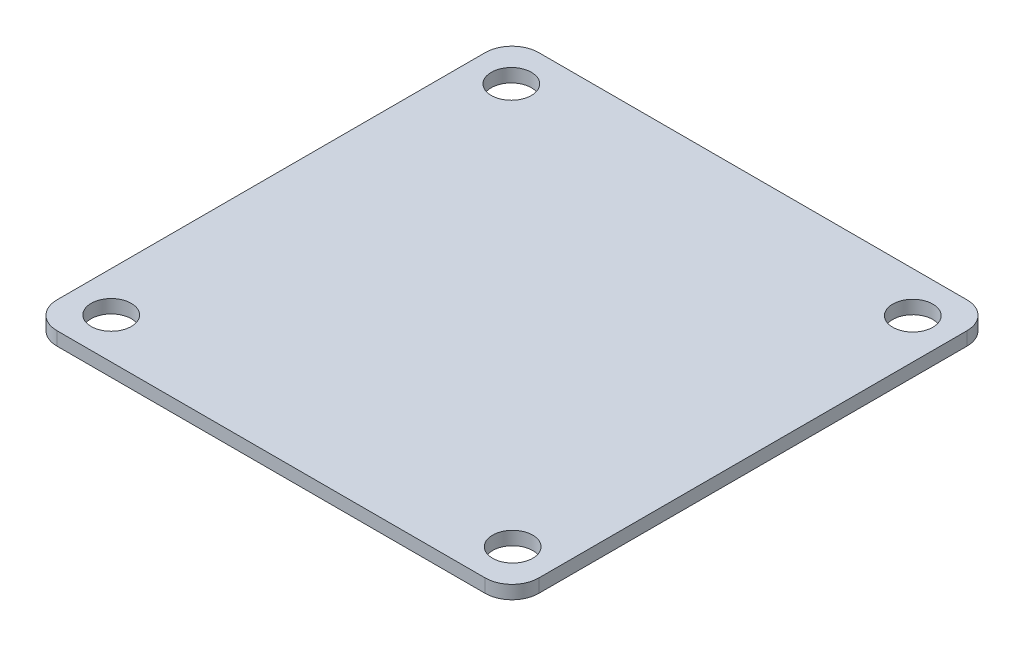
ISO-10303-21;
HEADER;
FILE_DESCRIPTION(('STEP AP214'),'2;1');
FILE_NAME('part.step','',(''),(''),'','','');
FILE_SCHEMA(('AUTOMOTIVE_DESIGN { 1 0 10303 214 1 1 1 1 }'));
ENDSEC;
DATA;
#1=APPLICATION_CONTEXT('core data for automotive mechanical design processes');
#2=APPLICATION_PROTOCOL_DEFINITION('international standard','automotive_design',2000,#1);
#3=PRODUCT_CONTEXT('',#1,'mechanical');
#4=PRODUCT('Part','Part','',(#3));
#5=PRODUCT_RELATED_PRODUCT_CATEGORY('part','',(#4));
#6=PRODUCT_DEFINITION_FORMATION('','',#4);
#7=PRODUCT_DEFINITION_CONTEXT('part definition',#1,'design');
#8=PRODUCT_DEFINITION('design','',#6,#7);
#9=PRODUCT_DEFINITION_SHAPE('','',#8);
#10=(LENGTH_UNIT() NAMED_UNIT(*) SI_UNIT(.MILLI.,.METRE.));
#11=(NAMED_UNIT(*) PLANE_ANGLE_UNIT() SI_UNIT($,.RADIAN.));
#12=(NAMED_UNIT(*) SI_UNIT($,.STERADIAN.) SOLID_ANGLE_UNIT());
#13=UNCERTAINTY_MEASURE_WITH_UNIT(LENGTH_MEASURE(1.E-05),#10,'distance_accuracy_value','');
#14=(GEOMETRIC_REPRESENTATION_CONTEXT(3) GLOBAL_UNCERTAINTY_ASSIGNED_CONTEXT((#13)) GLOBAL_UNIT_ASSIGNED_CONTEXT((#10,
#11,#12)) REPRESENTATION_CONTEXT('',''));
#15=CARTESIAN_POINT('',(0.,0.,0.));
#16=DIRECTION('',(0.,0.,1.));
#17=DIRECTION('',(1.,0.,0.));
#18=AXIS2_PLACEMENT_3D('',#15,#16,#17);
#19=CARTESIAN_POINT('',(0.,1.25767452008319E-13,-36.));
#20=DIRECTION('',(0.,1.,0.));
#21=DIRECTION('',(0.,0.,1.));
#22=AXIS2_PLACEMENT_3D('',#19,#20,#21);
#23=PLANE('',#22);
#24=DIRECTION('',(0.,0.,-1.));
#25=VECTOR('',#24,1.);
#26=CARTESIAN_POINT('',(0.,1.25767452008319E-13,-36.));
#27=LINE('',#26,#25);
#28=CARTESIAN_POINT('',(0.,-1.11653279033015E-13,-2.));
#29=VERTEX_POINT('',#28);
#30=CARTESIAN_POINT('',(0.,1.11801526652946E-13,-34.));
#31=VERTEX_POINT('',#30);
#32=EDGE_CURVE('E139',#29,#31,#27,.T.);
#33=ORIENTED_EDGE('',*,*,#32,.T.);
#34=CARTESIAN_POINT('',(2.,1.11801526652946E-13,-34.));
#35=DIRECTION('',(0.,1.,0.));
#36=DIRECTION('',(0.,0.,1.));
#37=AXIS2_PLACEMENT_3D('',#34,#35,#36);
#38=CIRCLE('',#37,2.);
#39=CARTESIAN_POINT('',(2.,1.25767452008319E-13,-36.));
#40=VERTEX_POINT('',#39);
#41=EDGE_CURVE('E153',#31,#40,#38,.F.);
#42=ORIENTED_EDGE('',*,*,#41,.T.);
#43=DIRECTION('',(1.,0.,0.));
#44=VECTOR('',#43,1.);
#45=CARTESIAN_POINT('',(0.,1.25767452008319E-13,-36.));
#46=LINE('',#45,#44);
#47=CARTESIAN_POINT('',(34.,1.25767452008319E-13,-36.));
#48=VERTEX_POINT('',#47);
#49=EDGE_CURVE('E120',#40,#48,#46,.T.);
#50=ORIENTED_EDGE('',*,*,#49,.T.);
#51=CARTESIAN_POINT('',(34.,1.11801526652946E-13,-34.));
#52=DIRECTION('',(0.,1.,0.));
#53=DIRECTION('',(0.,0.,1.));
#54=AXIS2_PLACEMENT_3D('',#51,#52,#53);
#55=CIRCLE('',#54,2.);
#56=CARTESIAN_POINT('',(36.,1.11801526652946E-13,-34.));
#57=VERTEX_POINT('',#56);
#58=EDGE_CURVE('E149',#48,#57,#55,.F.);
#59=ORIENTED_EDGE('',*,*,#58,.T.);
#60=DIRECTION('',(0.,0.,1.));
#61=VECTOR('',#60,1.);
#62=CARTESIAN_POINT('',(36.,1.25767452008319E-13,-36.));
#63=LINE('',#62,#61);
#64=CARTESIAN_POINT('',(36.,-1.11653279033015E-13,-2.));
#65=VERTEX_POINT('',#64);
#66=EDGE_CURVE('E162',#57,#65,#63,.T.);
#67=ORIENTED_EDGE('',*,*,#66,.T.);
#68=CARTESIAN_POINT('',(34.,-1.11653279033015E-13,-2.));
#69=DIRECTION('',(0.,1.,0.));
#70=DIRECTION('',(0.,0.,1.));
#71=AXIS2_PLACEMENT_3D('',#68,#69,#70);
#72=CIRCLE('',#71,2.);
#73=CARTESIAN_POINT('',(34.,-1.25550611573821E-13,0.));
#74=VERTEX_POINT('',#73);
#75=EDGE_CURVE('E55',#65,#74,#72,.F.);
#76=ORIENTED_EDGE('',*,*,#75,.T.);
#77=DIRECTION('',(-1.,0.,0.));
#78=VECTOR('',#77,1.);
#79=CARTESIAN_POINT('',(0.,-1.25550611573821E-13,0.));
#80=LINE('',#79,#78);
#81=CARTESIAN_POINT('',(2.,-1.25550611573821E-13,0.));
#82=VERTEX_POINT('',#81);
#83=EDGE_CURVE('E140',#74,#82,#80,.T.);
#84=ORIENTED_EDGE('',*,*,#83,.T.);
#85=CARTESIAN_POINT('',(2.,-1.11653279033015E-13,-2.));
#86=DIRECTION('',(0.,1.,0.));
#87=DIRECTION('',(0.,0.,1.));
#88=AXIS2_PLACEMENT_3D('',#85,#86,#87);
#89=CIRCLE('',#88,2.);
#90=EDGE_CURVE('E151',#82,#29,#89,.F.);
#91=ORIENTED_EDGE('',*,*,#90,.T.);
#92=EDGE_LOOP('',(#33,#42,#50,#59,#67,#76,#84,#91));
#93=FACE_BOUND('',#92,.T.);
#94=CARTESIAN_POINT('',(3.,-1.04300248993106E-13,-3.05));
#95=DIRECTION('',(0.,-1.,0.));
#96=DIRECTION('',(0.,0.,-1.));
#97=AXIS2_PLACEMENT_3D('',#94,#95,#96);
#98=CIRCLE('',#97,1.5);
#99=CARTESIAN_POINT('',(3.,0.,-4.55));
#100=VERTEX_POINT('',#99);
#101=EDGE_CURVE('E134',#100,#100,#98,.T.);
#102=ORIENTED_EDGE('',*,*,#101,.F.);
#103=EDGE_LOOP('',(#102));
#104=FACE_BOUND('',#103,.T.);
#105=CARTESIAN_POINT('',(33.,-1.04300248993106E-13,-3.05));
#106=DIRECTION('',(0.,-1.,0.));
#107=DIRECTION('',(0.,0.,-1.));
#108=AXIS2_PLACEMENT_3D('',#105,#106,#107);
#109=CIRCLE('',#108,1.5);
#110=CARTESIAN_POINT('',(33.,0.,-4.55));
#111=VERTEX_POINT('',#110);
#112=EDGE_CURVE('E185',#111,#111,#109,.T.);
#113=ORIENTED_EDGE('',*,*,#112,.F.);
#114=EDGE_LOOP('',(#113));
#115=FACE_BOUND('',#114,.T.);
#116=CARTESIAN_POINT('',(3.,1.04517089427603E-13,-32.95));
#117=DIRECTION('',(0.,-1.,0.));
#118=DIRECTION('',(0.,0.,-1.));
#119=AXIS2_PLACEMENT_3D('',#116,#117,#118);
#120=CIRCLE('',#119,1.5);
#121=CARTESIAN_POINT('',(3.,1.14991533444132E-13,-34.45));
#122=VERTEX_POINT('',#121);
#123=EDGE_CURVE('E191',#122,#122,#120,.T.);
#124=ORIENTED_EDGE('',*,*,#123,.F.);
#125=EDGE_LOOP('',(#124));
#126=FACE_BOUND('',#125,.T.);
#127=CARTESIAN_POINT('',(33.,1.04517089427603E-13,-32.95));
#128=DIRECTION('',(0.,-1.,0.));
#129=DIRECTION('',(0.,0.,-1.));
#130=AXIS2_PLACEMENT_3D('',#127,#128,#129);
#131=CIRCLE('',#130,1.5);
#132=CARTESIAN_POINT('',(33.,1.14991533444132E-13,-34.45));
#133=VERTEX_POINT('',#132);
#134=EDGE_CURVE('E197',#133,#133,#131,.T.);
#135=ORIENTED_EDGE('',*,*,#134,.F.);
#136=EDGE_LOOP('',(#135));
#137=FACE_BOUND('',#136,.T.);
#138=ADVANCED_FACE('F33',(#93,#104,#115,#126,#137),#23,.F.);
#139=CARTESIAN_POINT('',(0.,1.00000000000013,-36.));
#140=DIRECTION('',(0.,1.,0.));
#141=DIRECTION('',(0.,0.,1.));
#142=AXIS2_PLACEMENT_3D('',#139,#140,#141);
#143=PLANE('',#142);
#144=CARTESIAN_POINT('',(3.,1.0000000000001,-32.95));
#145=DIRECTION('',(0.,-1.,0.));
#146=DIRECTION('',(0.,0.,-1.));
#147=AXIS2_PLACEMENT_3D('',#144,#145,#146);
#148=CIRCLE('',#147,1.5);
#149=CARTESIAN_POINT('',(3.,1.00000000000012,-34.45));
#150=VERTEX_POINT('',#149);
#151=EDGE_CURVE('E194',#150,#150,#148,.T.);
#152=ORIENTED_EDGE('',*,*,#151,.T.);
#153=EDGE_LOOP('',(#152));
#154=FACE_BOUND('',#153,.T.);
#155=CARTESIAN_POINT('',(3.,0.999999999999896,-3.04999999999999));
#156=DIRECTION('',(0.,-1.,0.));
#157=DIRECTION('',(0.,0.,-1.));
#158=AXIS2_PLACEMENT_3D('',#155,#156,#157);
#159=CIRCLE('',#158,1.5);
#160=CARTESIAN_POINT('',(3.,0.999999999999906,-4.54999999999999));
#161=VERTEX_POINT('',#160);
#162=EDGE_CURVE('E182',#161,#161,#159,.T.);
#163=ORIENTED_EDGE('',*,*,#162,.T.);
#164=EDGE_LOOP('',(#163));
#165=FACE_BOUND('',#164,.T.);
#166=DIRECTION('',(1.,0.,0.));
#167=VECTOR('',#166,1.);
#168=CARTESIAN_POINT('',(0.,1.00000000000013,-36.));
#169=LINE('',#168,#167);
#170=CARTESIAN_POINT('',(2.,1.00000000000013,-36.));
#171=VERTEX_POINT('',#170);
#172=CARTESIAN_POINT('',(34.,1.00000000000013,-36.));
#173=VERTEX_POINT('',#172);
#174=EDGE_CURVE('E117',#171,#173,#169,.T.);
#175=ORIENTED_EDGE('',*,*,#174,.F.);
#176=CARTESIAN_POINT('',(2.,1.00000000000011,-34.));
#177=DIRECTION('',(0.,1.,0.));
#178=DIRECTION('',(0.,0.,1.));
#179=AXIS2_PLACEMENT_3D('',#176,#177,#178);
#180=CIRCLE('',#179,2.);
#181=CARTESIAN_POINT('',(0.,1.00000000000011,-34.));
#182=VERTEX_POINT('',#181);
#183=EDGE_CURVE('E100',#171,#182,#180,.T.);
#184=ORIENTED_EDGE('',*,*,#183,.T.);
#185=DIRECTION('',(0.,0.,-1.));
#186=VECTOR('',#185,1.);
#187=CARTESIAN_POINT('',(0.,1.00000000000013,-36.));
#188=LINE('',#187,#186);
#189=CARTESIAN_POINT('',(0.,0.999999999999888,-1.99999999999999));
#190=VERTEX_POINT('',#189);
#191=EDGE_CURVE('E129',#190,#182,#188,.T.);
#192=ORIENTED_EDGE('',*,*,#191,.F.);
#193=CARTESIAN_POINT('',(2.,0.999999999999888,-1.99999999999999));
#194=DIRECTION('',(0.,1.,0.));
#195=DIRECTION('',(0.,0.,1.));
#196=AXIS2_PLACEMENT_3D('',#193,#194,#195);
#197=CIRCLE('',#196,2.);
#198=CARTESIAN_POINT('',(2.,0.999999999999874,0.));
#199=VERTEX_POINT('',#198);
#200=EDGE_CURVE('E111',#190,#199,#197,.T.);
#201=ORIENTED_EDGE('',*,*,#200,.T.);
#202=DIRECTION('',(-1.,0.,0.));
#203=VECTOR('',#202,1.);
#204=CARTESIAN_POINT('',(0.,0.999999999999874,0.));
#205=LINE('',#204,#203);
#206=CARTESIAN_POINT('',(34.,0.999999999999874,0.));
#207=VERTEX_POINT('',#206);
#208=EDGE_CURVE('E132',#207,#199,#205,.T.);
#209=ORIENTED_EDGE('',*,*,#208,.F.);
#210=CARTESIAN_POINT('',(34.,0.999999999999888,-1.99999999999999));
#211=DIRECTION('',(0.,1.,0.));
#212=DIRECTION('',(0.,0.,1.));
#213=AXIS2_PLACEMENT_3D('',#210,#211,#212);
#214=CIRCLE('',#213,2.);
#215=CARTESIAN_POINT('',(36.,0.999999999999888,-1.99999999999999));
#216=VERTEX_POINT('',#215);
#217=EDGE_CURVE('E121',#207,#216,#214,.T.);
#218=ORIENTED_EDGE('',*,*,#217,.T.);
#219=DIRECTION('',(0.,0.,1.));
#220=VECTOR('',#219,1.);
#221=CARTESIAN_POINT('',(36.,1.00000000000013,-36.));
#222=LINE('',#221,#220);
#223=CARTESIAN_POINT('',(36.,1.00000000000011,-34.));
#224=VERTEX_POINT('',#223);
#225=EDGE_CURVE('E128',#224,#216,#222,.T.);
#226=ORIENTED_EDGE('',*,*,#225,.F.);
#227=CARTESIAN_POINT('',(34.,1.00000000000011,-34.));
#228=DIRECTION('',(0.,1.,0.));
#229=DIRECTION('',(0.,0.,1.));
#230=AXIS2_PLACEMENT_3D('',#227,#228,#229);
#231=CIRCLE('',#230,2.);
#232=EDGE_CURVE('E127',#224,#173,#231,.T.);
#233=ORIENTED_EDGE('',*,*,#232,.T.);
#234=EDGE_LOOP('',(#175,#184,#192,#201,#209,#218,#226,#233));
#235=FACE_BOUND('',#234,.T.);
#236=CARTESIAN_POINT('',(33.,0.999999999999896,-3.04999999999999));
#237=DIRECTION('',(0.,-1.,0.));
#238=DIRECTION('',(0.,0.,-1.));
#239=AXIS2_PLACEMENT_3D('',#236,#237,#238);
#240=CIRCLE('',#239,1.5);
#241=CARTESIAN_POINT('',(33.,0.999999999999906,-4.54999999999999));
#242=VERTEX_POINT('',#241);
#243=EDGE_CURVE('E188',#242,#242,#240,.T.);
#244=ORIENTED_EDGE('',*,*,#243,.T.);
#245=EDGE_LOOP('',(#244));
#246=FACE_BOUND('',#245,.T.);
#247=CARTESIAN_POINT('',(33.,1.0000000000001,-32.95));
#248=DIRECTION('',(0.,-1.,0.));
#249=DIRECTION('',(0.,0.,-1.));
#250=AXIS2_PLACEMENT_3D('',#247,#248,#249);
#251=CIRCLE('',#250,1.5);
#252=CARTESIAN_POINT('',(33.,1.00000000000012,-34.45));
#253=VERTEX_POINT('',#252);
#254=EDGE_CURVE('E200',#253,#253,#251,.T.);
#255=ORIENTED_EDGE('',*,*,#254,.T.);
#256=EDGE_LOOP('',(#255));
#257=FACE_BOUND('',#256,.T.);
#258=ADVANCED_FACE('F124',(#154,#165,#235,#246,#257),#143,.T.);
#259=CARTESIAN_POINT('',(0.,1.25767452008319E-13,-36.));
#260=DIRECTION('',(1.,0.,0.));
#261=DIRECTION('',(0.,0.,1.));
#262=AXIS2_PLACEMENT_3D('',#259,#260,#261);
#263=PLANE('',#262);
#264=ORIENTED_EDGE('',*,*,#191,.T.);
#265=DIRECTION('',(0.,1.,0.));
#266=VECTOR('',#265,1.);
#267=CARTESIAN_POINT('',(0.,1.11801526652946E-13,-34.));
#268=LINE('',#267,#266);
#269=EDGE_CURVE('E105',#182,#31,#268,.F.);
#270=ORIENTED_EDGE('',*,*,#269,.T.);
#271=ORIENTED_EDGE('',*,*,#32,.F.);
#272=DIRECTION('',(0.,1.,0.));
#273=VECTOR('',#272,1.);
#274=CARTESIAN_POINT('',(0.,-1.11653279033015E-13,-2.));
#275=LINE('',#274,#273);
#276=EDGE_CURVE('E110',#29,#190,#275,.T.);
#277=ORIENTED_EDGE('',*,*,#276,.T.);
#278=EDGE_LOOP('',(#264,#270,#271,#277));
#279=FACE_BOUND('',#278,.T.);
#280=ADVANCED_FACE('F178',(#279),#263,.F.);
#281=CARTESIAN_POINT('',(0.,1.25767452008319E-13,-36.));
#282=DIRECTION('',(0.,0.,1.));
#283=DIRECTION('',(-1.,0.,0.));
#284=AXIS2_PLACEMENT_3D('',#281,#282,#283);
#285=PLANE('',#284);
#286=ORIENTED_EDGE('',*,*,#49,.F.);
#287=DIRECTION('',(0.,1.,0.));
#288=VECTOR('',#287,1.);
#289=CARTESIAN_POINT('',(2.,1.25767452008319E-13,-36.));
#290=LINE('',#289,#288);
#291=EDGE_CURVE('E104',#40,#171,#290,.T.);
#292=ORIENTED_EDGE('',*,*,#291,.T.);
#293=ORIENTED_EDGE('',*,*,#174,.T.);
#294=DIRECTION('',(0.,1.,0.));
#295=VECTOR('',#294,1.);
#296=CARTESIAN_POINT('',(34.,1.25767452008319E-13,-36.));
#297=LINE('',#296,#295);
#298=EDGE_CURVE('E122',#173,#48,#297,.F.);
#299=ORIENTED_EDGE('',*,*,#298,.T.);
#300=EDGE_LOOP('',(#286,#292,#293,#299));
#301=FACE_BOUND('',#300,.T.);
#302=ADVANCED_FACE('F116',(#301),#285,.F.);
#303=CARTESIAN_POINT('',(36.,1.25767452008319E-13,-36.));
#304=DIRECTION('',(-1.,0.,0.));
#305=DIRECTION('',(0.,0.,-1.));
#306=AXIS2_PLACEMENT_3D('',#303,#304,#305);
#307=PLANE('',#306);
#308=ORIENTED_EDGE('',*,*,#66,.F.);
#309=DIRECTION('',(0.,1.,0.));
#310=VECTOR('',#309,1.);
#311=CARTESIAN_POINT('',(36.,1.11801526652946E-13,-34.));
#312=LINE('',#311,#310);
#313=EDGE_CURVE('E11',#57,#224,#312,.T.);
#314=ORIENTED_EDGE('',*,*,#313,.T.);
#315=ORIENTED_EDGE('',*,*,#225,.T.);
#316=DIRECTION('',(0.,1.,0.));
#317=VECTOR('',#316,1.);
#318=CARTESIAN_POINT('',(36.,-1.11653279033015E-13,-2.));
#319=LINE('',#318,#317);
#320=EDGE_CURVE('E41',#216,#65,#319,.F.);
#321=ORIENTED_EDGE('',*,*,#320,.T.);
#322=EDGE_LOOP('',(#308,#314,#315,#321));
#323=FACE_BOUND('',#322,.T.);
#324=ADVANCED_FACE('F161',(#323),#307,.F.);
#325=CARTESIAN_POINT('',(0.,-1.25550611573821E-13,0.));
#326=DIRECTION('',(0.,0.,-1.));
#327=DIRECTION('',(1.,0.,0.));
#328=AXIS2_PLACEMENT_3D('',#325,#326,#327);
#329=PLANE('',#328);
#330=ORIENTED_EDGE('',*,*,#208,.T.);
#331=DIRECTION('',(0.,1.,0.));
#332=VECTOR('',#331,1.);
#333=CARTESIAN_POINT('',(2.,-1.25550611573821E-13,0.));
#334=LINE('',#333,#332);
#335=EDGE_CURVE('E48',#199,#82,#334,.F.);
#336=ORIENTED_EDGE('',*,*,#335,.T.);
#337=ORIENTED_EDGE('',*,*,#83,.F.);
#338=DIRECTION('',(0.,1.,0.));
#339=VECTOR('',#338,1.);
#340=CARTESIAN_POINT('',(34.,-1.25550611573821E-13,0.));
#341=LINE('',#340,#339);
#342=EDGE_CURVE('E155',#74,#207,#341,.T.);
#343=ORIENTED_EDGE('',*,*,#342,.T.);
#344=EDGE_LOOP('',(#330,#336,#337,#343));
#345=FACE_BOUND('',#344,.T.);
#346=ADVANCED_FACE('F171',(#345),#329,.F.);
#347=CARTESIAN_POINT('',(3.,-1.04300248993106E-13,-3.05));
#348=DIRECTION('',(0.,1.,0.));
#349=DIRECTION('',(0.,0.,1.));
#350=AXIS2_PLACEMENT_3D('',#347,#348,#349);
#351=CYLINDRICAL_SURFACE('',#350,1.5);
#352=ORIENTED_EDGE('',*,*,#101,.T.);
#353=EDGE_LOOP('',(#352));
#354=FACE_BOUND('',#353,.T.);
#355=ORIENTED_EDGE('',*,*,#162,.F.);
#356=EDGE_LOOP('',(#355));
#357=FACE_BOUND('',#356,.T.);
#358=ADVANCED_FACE('F217',(#354,#357),#351,.F.);
#359=CARTESIAN_POINT('',(33.,-1.04300248993106E-13,-3.05));
#360=DIRECTION('',(0.,1.,0.));
#361=DIRECTION('',(0.,0.,1.));
#362=AXIS2_PLACEMENT_3D('',#359,#360,#361);
#363=CYLINDRICAL_SURFACE('',#362,1.5);
#364=ORIENTED_EDGE('',*,*,#112,.T.);
#365=EDGE_LOOP('',(#364));
#366=FACE_BOUND('',#365,.T.);
#367=ORIENTED_EDGE('',*,*,#243,.F.);
#368=EDGE_LOOP('',(#367));
#369=FACE_BOUND('',#368,.T.);
#370=ADVANCED_FACE('F309',(#366,#369),#363,.F.);
#371=CARTESIAN_POINT('',(3.,1.04517089427603E-13,-32.95));
#372=DIRECTION('',(0.,1.,0.));
#373=DIRECTION('',(0.,0.,1.));
#374=AXIS2_PLACEMENT_3D('',#371,#372,#373);
#375=CYLINDRICAL_SURFACE('',#374,1.5);
#376=ORIENTED_EDGE('',*,*,#123,.T.);
#377=EDGE_LOOP('',(#376));
#378=FACE_BOUND('',#377,.T.);
#379=ORIENTED_EDGE('',*,*,#151,.F.);
#380=EDGE_LOOP('',(#379));
#381=FACE_BOUND('',#380,.T.);
#382=ADVANCED_FACE('F300',(#378,#381),#375,.F.);
#383=CARTESIAN_POINT('',(33.,1.04517089427603E-13,-32.95));
#384=DIRECTION('',(0.,1.,0.));
#385=DIRECTION('',(0.,0.,1.));
#386=AXIS2_PLACEMENT_3D('',#383,#384,#385);
#387=CYLINDRICAL_SURFACE('',#386,1.5);
#388=ORIENTED_EDGE('',*,*,#134,.T.);
#389=EDGE_LOOP('',(#388));
#390=FACE_BOUND('',#389,.T.);
#391=ORIENTED_EDGE('',*,*,#254,.F.);
#392=EDGE_LOOP('',(#391));
#393=FACE_BOUND('',#392,.T.);
#394=ADVANCED_FACE('F206',(#390,#393),#387,.F.);
#395=CARTESIAN_POINT('',(2.,1.11801526652946E-13,-34.));
#396=DIRECTION('',(0.,1.,0.));
#397=DIRECTION('',(0.,0.,1.));
#398=AXIS2_PLACEMENT_3D('',#395,#396,#397);
#399=CYLINDRICAL_SURFACE('',#398,2.);
#400=ORIENTED_EDGE('',*,*,#41,.F.);
#401=ORIENTED_EDGE('',*,*,#269,.F.);
#402=ORIENTED_EDGE('',*,*,#183,.F.);
#403=ORIENTED_EDGE('',*,*,#291,.F.);
#404=EDGE_LOOP('',(#400,#401,#402,#403));
#405=FACE_BOUND('',#404,.T.);
#406=ADVANCED_FACE('F103',(#405),#399,.T.);
#407=CARTESIAN_POINT('',(2.,-1.11653279033015E-13,-2.));
#408=DIRECTION('',(0.,1.,0.));
#409=DIRECTION('',(0.,0.,1.));
#410=AXIS2_PLACEMENT_3D('',#407,#408,#409);
#411=CYLINDRICAL_SURFACE('',#410,2.);
#412=ORIENTED_EDGE('',*,*,#90,.F.);
#413=ORIENTED_EDGE('',*,*,#335,.F.);
#414=ORIENTED_EDGE('',*,*,#200,.F.);
#415=ORIENTED_EDGE('',*,*,#276,.F.);
#416=EDGE_LOOP('',(#412,#413,#414,#415));
#417=FACE_BOUND('',#416,.T.);
#418=ADVANCED_FACE('F175',(#417),#411,.T.);
#419=CARTESIAN_POINT('',(34.,1.11801526652946E-13,-34.));
#420=DIRECTION('',(0.,1.,0.));
#421=DIRECTION('',(0.,0.,1.));
#422=AXIS2_PLACEMENT_3D('',#419,#420,#421);
#423=CYLINDRICAL_SURFACE('',#422,2.);
#424=ORIENTED_EDGE('',*,*,#58,.F.);
#425=ORIENTED_EDGE('',*,*,#298,.F.);
#426=ORIENTED_EDGE('',*,*,#232,.F.);
#427=ORIENTED_EDGE('',*,*,#313,.F.);
#428=EDGE_LOOP('',(#424,#425,#426,#427));
#429=FACE_BOUND('',#428,.T.);
#430=ADVANCED_FACE('F231',(#429),#423,.T.);
#431=CARTESIAN_POINT('',(34.,-1.11584686218449E-13,-2.));
#432=DIRECTION('',(0.,1.,0.));
#433=DIRECTION('',(0.,0.,1.));
#434=AXIS2_PLACEMENT_3D('',#431,#432,#433);
#435=CYLINDRICAL_SURFACE('',#434,2.);
#436=ORIENTED_EDGE('',*,*,#75,.F.);
#437=ORIENTED_EDGE('',*,*,#320,.F.);
#438=ORIENTED_EDGE('',*,*,#217,.F.);
#439=ORIENTED_EDGE('',*,*,#342,.F.);
#440=EDGE_LOOP('',(#436,#437,#438,#439));
#441=FACE_BOUND('',#440,.T.);
#442=ADVANCED_FACE('F35',(#441),#435,.T.);
#443=CLOSED_SHELL('',(#138,#258,#280,#302,#324,#346,#358,#370,#382,#394,#406,#418,#430,#442));
#444=MANIFOLD_SOLID_BREP('B2',#443);
#445=ADVANCED_BREP_SHAPE_REPRESENTATION('',(#18,#444),#14);
#446=SHAPE_DEFINITION_REPRESENTATION(#9,#445);
ENDSEC;
END-ISO-10303-21;
